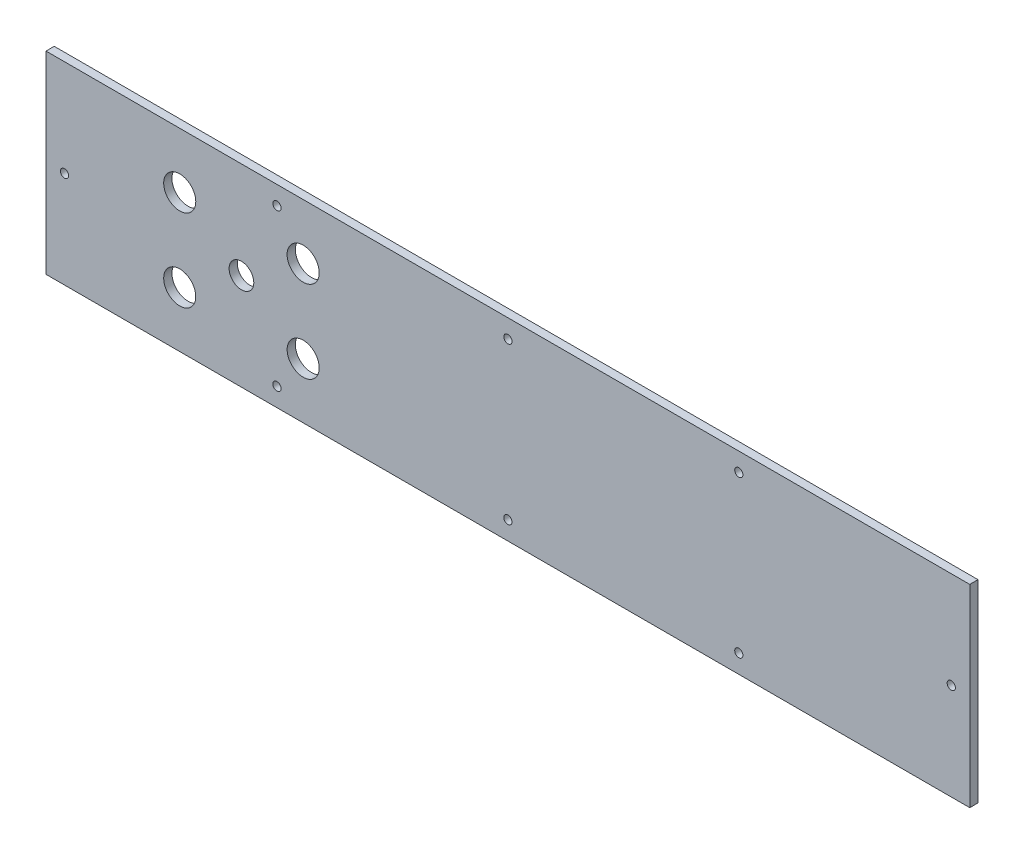
ISO-10303-21;
HEADER;
FILE_DESCRIPTION(('STEP AP214'),'2;1');
FILE_NAME('part.step','',(''),(''),'','','');
FILE_SCHEMA(('AUTOMOTIVE_DESIGN { 1 0 10303 214 1 1 1 1 }'));
ENDSEC;
DATA;
#1=APPLICATION_CONTEXT('core data for automotive mechanical design processes');
#2=APPLICATION_PROTOCOL_DEFINITION('international standard','automotive_design',2000,#1);
#3=PRODUCT_CONTEXT('',#1,'mechanical');
#4=PRODUCT('Part','Part','',(#3));
#5=PRODUCT_RELATED_PRODUCT_CATEGORY('part','',(#4));
#6=PRODUCT_DEFINITION_FORMATION('','',#4);
#7=PRODUCT_DEFINITION_CONTEXT('part definition',#1,'design');
#8=PRODUCT_DEFINITION('design','',#6,#7);
#9=PRODUCT_DEFINITION_SHAPE('','',#8);
#10=(LENGTH_UNIT() NAMED_UNIT(*) SI_UNIT(.MILLI.,.METRE.));
#11=(NAMED_UNIT(*) PLANE_ANGLE_UNIT() SI_UNIT($,.RADIAN.));
#12=(NAMED_UNIT(*) SI_UNIT($,.STERADIAN.) SOLID_ANGLE_UNIT());
#13=UNCERTAINTY_MEASURE_WITH_UNIT(LENGTH_MEASURE(1.E-05),#10,'distance_accuracy_value','');
#14=(GEOMETRIC_REPRESENTATION_CONTEXT(3) GLOBAL_UNCERTAINTY_ASSIGNED_CONTEXT((#13)) GLOBAL_UNIT_ASSIGNED_CONTEXT((#10,
#11,#12)) REPRESENTATION_CONTEXT('',''));
#15=CARTESIAN_POINT('',(0.,0.,0.));
#16=DIRECTION('',(0.,0.,1.));
#17=DIRECTION('',(1.,0.,0.));
#18=AXIS2_PLACEMENT_3D('',#15,#16,#17);
#19=CARTESIAN_POINT('',(0.,0.,4.));
#20=DIRECTION('',(0.,0.,1.));
#21=DIRECTION('',(1.,0.,0.));
#22=AXIS2_PLACEMENT_3D('',#19,#20,#21);
#23=PLANE('',#22);
#24=CARTESIAN_POINT('',(-112.25,85.0000000000041,4.));
#25=DIRECTION('',(0.,0.,1.));
#26=DIRECTION('',(-1.,0.,0.));
#27=AXIS2_PLACEMENT_3D('',#24,#25,#26);
#28=CIRCLE('',#27,2.);
#29=CARTESIAN_POINT('',(-114.25,85.0000000000041,4.));
#30=VERTEX_POINT('',#29);
#31=EDGE_CURVE('E177',#30,#30,#28,.T.);
#32=ORIENTED_EDGE('',*,*,#31,.F.);
#33=EDGE_LOOP('',(#32));
#34=FACE_BOUND('',#33,.T.);
#35=CARTESIAN_POINT('',(-336.75,8.99999999999596,4.));
#36=DIRECTION('',(0.,0.,1.));
#37=DIRECTION('',(-1.,0.,0.));
#38=AXIS2_PLACEMENT_3D('',#35,#36,#37);
#39=CIRCLE('',#38,2.);
#40=CARTESIAN_POINT('',(-338.75,8.99999999999596,4.));
#41=VERTEX_POINT('',#40);
#42=EDGE_CURVE('E165',#41,#41,#39,.T.);
#43=ORIENTED_EDGE('',*,*,#42,.F.);
#44=EDGE_LOOP('',(#43));
#45=FACE_BOUND('',#44,.T.);
#46=CARTESIAN_POINT('',(-324.,66.9999999999999,4.));
#47=DIRECTION('',(0.,0.,1.));
#48=DIRECTION('',(-1.,0.,0.));
#49=AXIS2_PLACEMENT_3D('',#46,#47,#48);
#50=CIRCLE('',#49,7.79999999999999);
#51=CARTESIAN_POINT('',(-331.8,66.9999999999999,4.));
#52=VERTEX_POINT('',#51);
#53=EDGE_CURVE('E153',#52,#52,#50,.T.);
#54=ORIENTED_EDGE('',*,*,#53,.F.);
#55=EDGE_LOOP('',(#54));
#56=FACE_BOUND('',#55,.T.);
#57=CARTESIAN_POINT('',(-324.,26.9999999999999,4.));
#58=DIRECTION('',(0.,0.,1.));
#59=DIRECTION('',(1.,0.,0.));
#60=AXIS2_PLACEMENT_3D('',#57,#58,#59);
#61=CIRCLE('',#60,7.79999999999999);
#62=CARTESIAN_POINT('',(-316.2,26.9999999999999,4.));
#63=VERTEX_POINT('',#62);
#64=EDGE_CURVE('E141',#63,#63,#61,.T.);
#65=ORIENTED_EDGE('',*,*,#64,.F.);
#66=EDGE_LOOP('',(#65));
#67=FACE_BOUND('',#66,.T.);
#68=CARTESIAN_POINT('',(-440.,46.9999999999999,4.));
#69=DIRECTION('',(0.,0.,1.));
#70=DIRECTION('',(-1.,0.,0.));
#71=AXIS2_PLACEMENT_3D('',#68,#69,#70);
#72=CIRCLE('',#71,2.);
#73=CARTESIAN_POINT('',(-442.,46.9999999999999,4.));
#74=VERTEX_POINT('',#73);
#75=EDGE_CURVE('E129',#74,#74,#72,.T.);
#76=ORIENTED_EDGE('',*,*,#75,.F.);
#77=EDGE_LOOP('',(#76));
#78=FACE_BOUND('',#77,.T.);
#79=CARTESIAN_POINT('',(-224.5,84.9999999999999,4.));
#80=DIRECTION('',(0.,0.,1.));
#81=DIRECTION('',(1.,0.,0.));
#82=AXIS2_PLACEMENT_3D('',#79,#80,#81);
#83=CIRCLE('',#82,2.);
#84=CARTESIAN_POINT('',(-222.5,84.9999999999999,4.));
#85=VERTEX_POINT('',#84);
#86=EDGE_CURVE('E117',#85,#85,#83,.T.);
#87=ORIENTED_EDGE('',*,*,#86,.F.);
#88=EDGE_LOOP('',(#87));
#89=FACE_BOUND('',#88,.T.);
#90=DIRECTION('',(0.,1.,0.));
#91=VECTOR('',#90,1.);
#92=CARTESIAN_POINT('',(0.,0.,4.));
#93=LINE('',#92,#91);
#94=CARTESIAN_POINT('',(0.,0.,4.));
#95=VERTEX_POINT('',#94);
#96=CARTESIAN_POINT('',(0.,93.9999999999999,4.));
#97=VERTEX_POINT('',#96);
#98=EDGE_CURVE('E87',#95,#97,#93,.T.);
#99=ORIENTED_EDGE('',*,*,#98,.T.);
#100=DIRECTION('',(-1.,0.,0.));
#101=VECTOR('',#100,1.);
#102=CARTESIAN_POINT('',(0.,93.9999999999999,4.));
#103=LINE('',#102,#101);
#104=CARTESIAN_POINT('',(-449.,93.9999999999999,4.));
#105=VERTEX_POINT('',#104);
#106=EDGE_CURVE('E82',#97,#105,#103,.T.);
#107=ORIENTED_EDGE('',*,*,#106,.T.);
#108=DIRECTION('',(0.,-1.,0.));
#109=VECTOR('',#108,1.);
#110=CARTESIAN_POINT('',(-449.,0.,4.));
#111=LINE('',#110,#109);
#112=CARTESIAN_POINT('',(-449.,0.,4.));
#113=VERTEX_POINT('',#112);
#114=EDGE_CURVE('E85',#105,#113,#111,.T.);
#115=ORIENTED_EDGE('',*,*,#114,.T.);
#116=DIRECTION('',(1.,0.,0.));
#117=VECTOR('',#116,1.);
#118=CARTESIAN_POINT('',(0.,0.,4.));
#119=LINE('',#118,#117);
#120=EDGE_CURVE('E52',#113,#95,#119,.T.);
#121=ORIENTED_EDGE('',*,*,#120,.T.);
#122=EDGE_LOOP('',(#99,#107,#115,#121));
#123=FACE_BOUND('',#122,.T.);
#124=CARTESIAN_POINT('',(-384.,26.9999999999999,4.));
#125=DIRECTION('',(0.,0.,1.));
#126=DIRECTION('',(-1.,0.,0.));
#127=AXIS2_PLACEMENT_3D('',#124,#125,#126);
#128=CIRCLE('',#127,7.79999999999999);
#129=CARTESIAN_POINT('',(-391.8,26.9999999999999,4.));
#130=VERTEX_POINT('',#129);
#131=EDGE_CURVE('E102',#130,#130,#128,.T.);
#132=ORIENTED_EDGE('',*,*,#131,.F.);
#133=EDGE_LOOP('',(#132));
#134=FACE_BOUND('',#133,.T.);
#135=CARTESIAN_POINT('',(-9.,46.9999999999999,4.));
#136=DIRECTION('',(0.,0.,1.));
#137=DIRECTION('',(1.,0.,0.));
#138=AXIS2_PLACEMENT_3D('',#135,#136,#137);
#139=CIRCLE('',#138,2.);
#140=CARTESIAN_POINT('',(-7.,46.9999999999999,4.));
#141=VERTEX_POINT('',#140);
#142=EDGE_CURVE('E123',#141,#141,#139,.T.);
#143=ORIENTED_EDGE('',*,*,#142,.F.);
#144=EDGE_LOOP('',(#143));
#145=FACE_BOUND('',#144,.T.);
#146=CARTESIAN_POINT('',(-224.5,8.99999999999998,4.));
#147=DIRECTION('',(0.,0.,1.));
#148=DIRECTION('',(-1.,0.,0.));
#149=AXIS2_PLACEMENT_3D('',#146,#147,#148);
#150=CIRCLE('',#149,2.);
#151=CARTESIAN_POINT('',(-226.5,8.99999999999998,4.));
#152=VERTEX_POINT('',#151);
#153=EDGE_CURVE('E135',#152,#152,#150,.T.);
#154=ORIENTED_EDGE('',*,*,#153,.F.);
#155=EDGE_LOOP('',(#154));
#156=FACE_BOUND('',#155,.T.);
#157=CARTESIAN_POINT('',(-384.,66.9999999999999,4.));
#158=DIRECTION('',(0.,0.,1.));
#159=DIRECTION('',(1.,0.,0.));
#160=AXIS2_PLACEMENT_3D('',#157,#158,#159);
#161=CIRCLE('',#160,7.79999999999999);
#162=CARTESIAN_POINT('',(-376.2,66.9999999999999,4.));
#163=VERTEX_POINT('',#162);
#164=EDGE_CURVE('E147',#163,#163,#161,.T.);
#165=ORIENTED_EDGE('',*,*,#164,.F.);
#166=EDGE_LOOP('',(#165));
#167=FACE_BOUND('',#166,.T.);
#168=CARTESIAN_POINT('',(-336.75,85.0000000000039,4.));
#169=DIRECTION('',(0.,0.,1.));
#170=DIRECTION('',(1.,0.,0.));
#171=AXIS2_PLACEMENT_3D('',#168,#169,#170);
#172=CIRCLE('',#171,2.);
#173=CARTESIAN_POINT('',(-334.75,85.0000000000039,4.));
#174=VERTEX_POINT('',#173);
#175=EDGE_CURVE('E159',#174,#174,#172,.T.);
#176=ORIENTED_EDGE('',*,*,#175,.F.);
#177=EDGE_LOOP('',(#176));
#178=FACE_BOUND('',#177,.T.);
#179=CARTESIAN_POINT('',(-112.25,8.99999999999618,4.));
#180=DIRECTION('',(0.,0.,1.));
#181=DIRECTION('',(1.,0.,0.));
#182=AXIS2_PLACEMENT_3D('',#179,#180,#181);
#183=CIRCLE('',#182,2.);
#184=CARTESIAN_POINT('',(-110.25,8.99999999999618,4.));
#185=VERTEX_POINT('',#184);
#186=EDGE_CURVE('E171',#185,#185,#183,.T.);
#187=ORIENTED_EDGE('',*,*,#186,.F.);
#188=EDGE_LOOP('',(#187));
#189=FACE_BOUND('',#188,.T.);
#190=CARTESIAN_POINT('',(-354.,46.9999999999999,4.));
#191=DIRECTION('',(0.,0.,1.));
#192=DIRECTION('',(1.,0.,0.));
#193=AXIS2_PLACEMENT_3D('',#190,#191,#192);
#194=CIRCLE('',#193,5.99999999999999);
#195=CARTESIAN_POINT('',(-348.,46.9999999999999,4.));
#196=VERTEX_POINT('',#195);
#197=EDGE_CURVE('E183',#196,#196,#194,.T.);
#198=ORIENTED_EDGE('',*,*,#197,.F.);
#199=EDGE_LOOP('',(#198));
#200=FACE_BOUND('',#199,.T.);
#201=ADVANCED_FACE('F35',(#34,#45,#56,#67,#78,#89,#123,#134,#145,#156,#167,#178,#189,#200),#23,.T.);
#202=CARTESIAN_POINT('',(0.,0.,0.));
#203=DIRECTION('',(0.,0.,1.));
#204=DIRECTION('',(1.,0.,0.));
#205=AXIS2_PLACEMENT_3D('',#202,#203,#204);
#206=PLANE('',#205);
#207=CARTESIAN_POINT('',(-112.25,85.0000000000041,0.));
#208=DIRECTION('',(0.,0.,1.));
#209=DIRECTION('',(-1.,0.,0.));
#210=AXIS2_PLACEMENT_3D('',#207,#208,#209);
#211=CIRCLE('',#210,2.);
#212=CARTESIAN_POINT('',(-114.25,85.0000000000041,0.));
#213=VERTEX_POINT('',#212);
#214=EDGE_CURVE('E180',#213,#213,#211,.T.);
#215=ORIENTED_EDGE('',*,*,#214,.T.);
#216=EDGE_LOOP('',(#215));
#217=FACE_BOUND('',#216,.T.);
#218=CARTESIAN_POINT('',(-336.75,8.99999999999596,0.));
#219=DIRECTION('',(0.,0.,1.));
#220=DIRECTION('',(-1.,0.,0.));
#221=AXIS2_PLACEMENT_3D('',#218,#219,#220);
#222=CIRCLE('',#221,2.);
#223=CARTESIAN_POINT('',(-338.75,8.99999999999596,0.));
#224=VERTEX_POINT('',#223);
#225=EDGE_CURVE('E168',#224,#224,#222,.T.);
#226=ORIENTED_EDGE('',*,*,#225,.T.);
#227=EDGE_LOOP('',(#226));
#228=FACE_BOUND('',#227,.T.);
#229=CARTESIAN_POINT('',(-324.,66.9999999999999,0.));
#230=DIRECTION('',(0.,0.,1.));
#231=DIRECTION('',(-1.,0.,0.));
#232=AXIS2_PLACEMENT_3D('',#229,#230,#231);
#233=CIRCLE('',#232,7.79999999999999);
#234=CARTESIAN_POINT('',(-331.8,66.9999999999999,0.));
#235=VERTEX_POINT('',#234);
#236=EDGE_CURVE('E156',#235,#235,#233,.T.);
#237=ORIENTED_EDGE('',*,*,#236,.T.);
#238=EDGE_LOOP('',(#237));
#239=FACE_BOUND('',#238,.T.);
#240=CARTESIAN_POINT('',(-324.,26.9999999999999,0.));
#241=DIRECTION('',(0.,0.,1.));
#242=DIRECTION('',(1.,0.,0.));
#243=AXIS2_PLACEMENT_3D('',#240,#241,#242);
#244=CIRCLE('',#243,7.79999999999999);
#245=CARTESIAN_POINT('',(-316.2,26.9999999999999,0.));
#246=VERTEX_POINT('',#245);
#247=EDGE_CURVE('E144',#246,#246,#244,.T.);
#248=ORIENTED_EDGE('',*,*,#247,.T.);
#249=EDGE_LOOP('',(#248));
#250=FACE_BOUND('',#249,.T.);
#251=CARTESIAN_POINT('',(-440.,46.9999999999999,0.));
#252=DIRECTION('',(0.,0.,1.));
#253=DIRECTION('',(-1.,0.,0.));
#254=AXIS2_PLACEMENT_3D('',#251,#252,#253);
#255=CIRCLE('',#254,2.);
#256=CARTESIAN_POINT('',(-442.,46.9999999999999,0.));
#257=VERTEX_POINT('',#256);
#258=EDGE_CURVE('E132',#257,#257,#255,.T.);
#259=ORIENTED_EDGE('',*,*,#258,.T.);
#260=EDGE_LOOP('',(#259));
#261=FACE_BOUND('',#260,.T.);
#262=CARTESIAN_POINT('',(-224.5,84.9999999999999,0.));
#263=DIRECTION('',(0.,0.,1.));
#264=DIRECTION('',(1.,0.,0.));
#265=AXIS2_PLACEMENT_3D('',#262,#263,#264);
#266=CIRCLE('',#265,2.);
#267=CARTESIAN_POINT('',(-222.5,84.9999999999999,0.));
#268=VERTEX_POINT('',#267);
#269=EDGE_CURVE('E120',#268,#268,#266,.T.);
#270=ORIENTED_EDGE('',*,*,#269,.T.);
#271=EDGE_LOOP('',(#270));
#272=FACE_BOUND('',#271,.T.);
#273=DIRECTION('',(0.,1.,0.));
#274=VECTOR('',#273,1.);
#275=CARTESIAN_POINT('',(0.,0.,0.));
#276=LINE('',#275,#274);
#277=CARTESIAN_POINT('',(0.,0.,0.));
#278=VERTEX_POINT('',#277);
#279=CARTESIAN_POINT('',(0.,93.9999999999999,0.));
#280=VERTEX_POINT('',#279);
#281=EDGE_CURVE('E99',#278,#280,#276,.T.);
#282=ORIENTED_EDGE('',*,*,#281,.F.);
#283=DIRECTION('',(1.,0.,0.));
#284=VECTOR('',#283,1.);
#285=CARTESIAN_POINT('',(0.,0.,0.));
#286=LINE('',#285,#284);
#287=CARTESIAN_POINT('',(-449.,0.,0.));
#288=VERTEX_POINT('',#287);
#289=EDGE_CURVE('E75',#288,#278,#286,.T.);
#290=ORIENTED_EDGE('',*,*,#289,.F.);
#291=DIRECTION('',(0.,-1.,0.));
#292=VECTOR('',#291,1.);
#293=CARTESIAN_POINT('',(-449.,0.,0.));
#294=LINE('',#293,#292);
#295=CARTESIAN_POINT('',(-449.,93.9999999999999,0.));
#296=VERTEX_POINT('',#295);
#297=EDGE_CURVE('E69',#296,#288,#294,.T.);
#298=ORIENTED_EDGE('',*,*,#297,.F.);
#299=DIRECTION('',(-1.,0.,0.));
#300=VECTOR('',#299,1.);
#301=CARTESIAN_POINT('',(0.,93.9999999999999,0.));
#302=LINE('',#301,#300);
#303=EDGE_CURVE('E91',#280,#296,#302,.T.);
#304=ORIENTED_EDGE('',*,*,#303,.F.);
#305=EDGE_LOOP('',(#282,#290,#298,#304));
#306=FACE_BOUND('',#305,.T.);
#307=CARTESIAN_POINT('',(-384.,26.9999999999999,0.));
#308=DIRECTION('',(0.,0.,1.));
#309=DIRECTION('',(-1.,0.,0.));
#310=AXIS2_PLACEMENT_3D('',#307,#308,#309);
#311=CIRCLE('',#310,7.79999999999999);
#312=CARTESIAN_POINT('',(-391.8,26.9999999999999,0.));
#313=VERTEX_POINT('',#312);
#314=EDGE_CURVE('E114',#313,#313,#311,.T.);
#315=ORIENTED_EDGE('',*,*,#314,.T.);
#316=EDGE_LOOP('',(#315));
#317=FACE_BOUND('',#316,.T.);
#318=CARTESIAN_POINT('',(-9.,46.9999999999999,0.));
#319=DIRECTION('',(0.,0.,1.));
#320=DIRECTION('',(1.,0.,0.));
#321=AXIS2_PLACEMENT_3D('',#318,#319,#320);
#322=CIRCLE('',#321,2.);
#323=CARTESIAN_POINT('',(-7.,46.9999999999999,0.));
#324=VERTEX_POINT('',#323);
#325=EDGE_CURVE('E126',#324,#324,#322,.T.);
#326=ORIENTED_EDGE('',*,*,#325,.T.);
#327=EDGE_LOOP('',(#326));
#328=FACE_BOUND('',#327,.T.);
#329=CARTESIAN_POINT('',(-224.5,8.99999999999998,0.));
#330=DIRECTION('',(0.,0.,1.));
#331=DIRECTION('',(-1.,0.,0.));
#332=AXIS2_PLACEMENT_3D('',#329,#330,#331);
#333=CIRCLE('',#332,2.);
#334=CARTESIAN_POINT('',(-226.5,8.99999999999998,0.));
#335=VERTEX_POINT('',#334);
#336=EDGE_CURVE('E138',#335,#335,#333,.T.);
#337=ORIENTED_EDGE('',*,*,#336,.T.);
#338=EDGE_LOOP('',(#337));
#339=FACE_BOUND('',#338,.T.);
#340=CARTESIAN_POINT('',(-384.,66.9999999999999,0.));
#341=DIRECTION('',(0.,0.,1.));
#342=DIRECTION('',(1.,0.,0.));
#343=AXIS2_PLACEMENT_3D('',#340,#341,#342);
#344=CIRCLE('',#343,7.79999999999999);
#345=CARTESIAN_POINT('',(-376.2,66.9999999999999,0.));
#346=VERTEX_POINT('',#345);
#347=EDGE_CURVE('E150',#346,#346,#344,.T.);
#348=ORIENTED_EDGE('',*,*,#347,.T.);
#349=EDGE_LOOP('',(#348));
#350=FACE_BOUND('',#349,.T.);
#351=CARTESIAN_POINT('',(-336.75,85.0000000000039,0.));
#352=DIRECTION('',(0.,0.,1.));
#353=DIRECTION('',(1.,0.,0.));
#354=AXIS2_PLACEMENT_3D('',#351,#352,#353);
#355=CIRCLE('',#354,2.);
#356=CARTESIAN_POINT('',(-334.75,85.0000000000039,0.));
#357=VERTEX_POINT('',#356);
#358=EDGE_CURVE('E162',#357,#357,#355,.T.);
#359=ORIENTED_EDGE('',*,*,#358,.T.);
#360=EDGE_LOOP('',(#359));
#361=FACE_BOUND('',#360,.T.);
#362=CARTESIAN_POINT('',(-112.25,8.99999999999618,0.));
#363=DIRECTION('',(0.,0.,1.));
#364=DIRECTION('',(1.,0.,0.));
#365=AXIS2_PLACEMENT_3D('',#362,#363,#364);
#366=CIRCLE('',#365,2.);
#367=CARTESIAN_POINT('',(-110.25,8.99999999999618,0.));
#368=VERTEX_POINT('',#367);
#369=EDGE_CURVE('E174',#368,#368,#366,.T.);
#370=ORIENTED_EDGE('',*,*,#369,.T.);
#371=EDGE_LOOP('',(#370));
#372=FACE_BOUND('',#371,.T.);
#373=CARTESIAN_POINT('',(-354.,46.9999999999999,0.));
#374=DIRECTION('',(0.,0.,1.));
#375=DIRECTION('',(1.,0.,0.));
#376=AXIS2_PLACEMENT_3D('',#373,#374,#375);
#377=CIRCLE('',#376,5.99999999999999);
#378=CARTESIAN_POINT('',(-348.,46.9999999999999,0.));
#379=VERTEX_POINT('',#378);
#380=EDGE_CURVE('E186',#379,#379,#377,.T.);
#381=ORIENTED_EDGE('',*,*,#380,.T.);
#382=EDGE_LOOP('',(#381));
#383=FACE_BOUND('',#382,.T.);
#384=ADVANCED_FACE('F110',(#217,#228,#239,#250,#261,#272,#306,#317,#328,#339,#350,#361,#372,
#383),#206,.F.);
#385=CARTESIAN_POINT('',(0.,0.,4.));
#386=DIRECTION('',(-1.,0.,0.));
#387=DIRECTION('',(0.,0.,1.));
#388=AXIS2_PLACEMENT_3D('',#385,#386,#387);
#389=PLANE('',#388);
#390=ORIENTED_EDGE('',*,*,#281,.T.);
#391=DIRECTION('',(0.,0.,-1.));
#392=VECTOR('',#391,1.);
#393=CARTESIAN_POINT('',(0.,93.9999999999999,4.));
#394=LINE('',#393,#392);
#395=EDGE_CURVE('E11',#97,#280,#394,.T.);
#396=ORIENTED_EDGE('',*,*,#395,.F.);
#397=ORIENTED_EDGE('',*,*,#98,.F.);
#398=DIRECTION('',(0.,0.,-1.));
#399=VECTOR('',#398,1.);
#400=CARTESIAN_POINT('',(0.,0.,4.));
#401=LINE('',#400,#399);
#402=EDGE_CURVE('E95',#95,#278,#401,.T.);
#403=ORIENTED_EDGE('',*,*,#402,.T.);
#404=EDGE_LOOP('',(#390,#396,#397,#403));
#405=FACE_BOUND('',#404,.T.);
#406=ADVANCED_FACE('F37',(#405),#389,.F.);
#407=CARTESIAN_POINT('',(0.,93.9999999999999,4.));
#408=DIRECTION('',(0.,-1.,0.));
#409=DIRECTION('',(1.,0.,0.));
#410=AXIS2_PLACEMENT_3D('',#407,#408,#409);
#411=PLANE('',#410);
#412=ORIENTED_EDGE('',*,*,#303,.T.);
#413=DIRECTION('',(0.,0.,-1.));
#414=VECTOR('',#413,1.);
#415=CARTESIAN_POINT('',(-449.,93.9999999999999,4.));
#416=LINE('',#415,#414);
#417=EDGE_CURVE('E44',#105,#296,#416,.T.);
#418=ORIENTED_EDGE('',*,*,#417,.F.);
#419=ORIENTED_EDGE('',*,*,#106,.F.);
#420=ORIENTED_EDGE('',*,*,#395,.T.);
#421=EDGE_LOOP('',(#412,#418,#419,#420));
#422=FACE_BOUND('',#421,.T.);
#423=ADVANCED_FACE('F90',(#422),#411,.F.);
#424=CARTESIAN_POINT('',(-449.,0.,4.));
#425=DIRECTION('',(1.,0.,0.));
#426=DIRECTION('',(0.,1.,0.));
#427=AXIS2_PLACEMENT_3D('',#424,#425,#426);
#428=PLANE('',#427);
#429=ORIENTED_EDGE('',*,*,#297,.T.);
#430=DIRECTION('',(0.,0.,-1.));
#431=VECTOR('',#430,1.);
#432=CARTESIAN_POINT('',(-449.,0.,4.));
#433=LINE('',#432,#431);
#434=EDGE_CURVE('E92',#113,#288,#433,.T.);
#435=ORIENTED_EDGE('',*,*,#434,.F.);
#436=ORIENTED_EDGE('',*,*,#114,.F.);
#437=ORIENTED_EDGE('',*,*,#417,.T.);
#438=EDGE_LOOP('',(#429,#435,#436,#437));
#439=FACE_BOUND('',#438,.T.);
#440=ADVANCED_FACE('F93',(#439),#428,.F.);
#441=CARTESIAN_POINT('',(0.,0.,4.));
#442=DIRECTION('',(0.,1.,0.));
#443=DIRECTION('',(-1.,0.,0.));
#444=AXIS2_PLACEMENT_3D('',#441,#442,#443);
#445=PLANE('',#444);
#446=ORIENTED_EDGE('',*,*,#289,.T.);
#447=ORIENTED_EDGE('',*,*,#402,.F.);
#448=ORIENTED_EDGE('',*,*,#120,.F.);
#449=ORIENTED_EDGE('',*,*,#434,.T.);
#450=EDGE_LOOP('',(#446,#447,#448,#449));
#451=FACE_BOUND('',#450,.T.);
#452=ADVANCED_FACE('F107',(#451),#445,.F.);
#453=CARTESIAN_POINT('',(-384.,26.9999999999999,4.));
#454=DIRECTION('',(0.,0.,-1.));
#455=DIRECTION('',(-1.,0.,0.));
#456=AXIS2_PLACEMENT_3D('',#453,#454,#455);
#457=CYLINDRICAL_SURFACE('',#456,7.79999999999999);
#458=ORIENTED_EDGE('',*,*,#131,.T.);
#459=EDGE_LOOP('',(#458));
#460=FACE_BOUND('',#459,.T.);
#461=ORIENTED_EDGE('',*,*,#314,.F.);
#462=EDGE_LOOP('',(#461));
#463=FACE_BOUND('',#462,.T.);
#464=ADVANCED_FACE('F206',(#460,#463),#457,.F.);
#465=CARTESIAN_POINT('',(-224.5,84.9999999999999,4.));
#466=DIRECTION('',(0.,0.,-1.));
#467=DIRECTION('',(-1.,0.,0.));
#468=AXIS2_PLACEMENT_3D('',#465,#466,#467);
#469=CYLINDRICAL_SURFACE('',#468,2.);
#470=ORIENTED_EDGE('',*,*,#86,.T.);
#471=EDGE_LOOP('',(#470));
#472=FACE_BOUND('',#471,.T.);
#473=ORIENTED_EDGE('',*,*,#269,.F.);
#474=EDGE_LOOP('',(#473));
#475=FACE_BOUND('',#474,.T.);
#476=ADVANCED_FACE('F254',(#472,#475),#469,.F.);
#477=CARTESIAN_POINT('',(-9.,46.9999999999999,4.));
#478=DIRECTION('',(0.,0.,-1.));
#479=DIRECTION('',(-1.,0.,0.));
#480=AXIS2_PLACEMENT_3D('',#477,#478,#479);
#481=CYLINDRICAL_SURFACE('',#480,2.);
#482=ORIENTED_EDGE('',*,*,#142,.T.);
#483=EDGE_LOOP('',(#482));
#484=FACE_BOUND('',#483,.T.);
#485=ORIENTED_EDGE('',*,*,#325,.F.);
#486=EDGE_LOOP('',(#485));
#487=FACE_BOUND('',#486,.T.);
#488=ADVANCED_FACE('F262',(#484,#487),#481,.F.);
#489=CARTESIAN_POINT('',(-440.,46.9999999999999,4.));
#490=DIRECTION('',(0.,0.,-1.));
#491=DIRECTION('',(-1.,0.,0.));
#492=AXIS2_PLACEMENT_3D('',#489,#490,#491);
#493=CYLINDRICAL_SURFACE('',#492,2.);
#494=ORIENTED_EDGE('',*,*,#75,.T.);
#495=EDGE_LOOP('',(#494));
#496=FACE_BOUND('',#495,.T.);
#497=ORIENTED_EDGE('',*,*,#258,.F.);
#498=EDGE_LOOP('',(#497));
#499=FACE_BOUND('',#498,.T.);
#500=ADVANCED_FACE('F270',(#496,#499),#493,.F.);
#501=CARTESIAN_POINT('',(-224.5,8.99999999999998,4.));
#502=DIRECTION('',(0.,0.,-1.));
#503=DIRECTION('',(-1.,0.,0.));
#504=AXIS2_PLACEMENT_3D('',#501,#502,#503);
#505=CYLINDRICAL_SURFACE('',#504,2.);
#506=ORIENTED_EDGE('',*,*,#153,.T.);
#507=EDGE_LOOP('',(#506));
#508=FACE_BOUND('',#507,.T.);
#509=ORIENTED_EDGE('',*,*,#336,.F.);
#510=EDGE_LOOP('',(#509));
#511=FACE_BOUND('',#510,.T.);
#512=ADVANCED_FACE('F279',(#508,#511),#505,.F.);
#513=CARTESIAN_POINT('',(-324.,26.9999999999999,4.));
#514=DIRECTION('',(0.,0.,-1.));
#515=DIRECTION('',(-1.,0.,0.));
#516=AXIS2_PLACEMENT_3D('',#513,#514,#515);
#517=CYLINDRICAL_SURFACE('',#516,7.79999999999999);
#518=ORIENTED_EDGE('',*,*,#64,.T.);
#519=EDGE_LOOP('',(#518));
#520=FACE_BOUND('',#519,.T.);
#521=ORIENTED_EDGE('',*,*,#247,.F.);
#522=EDGE_LOOP('',(#521));
#523=FACE_BOUND('',#522,.T.);
#524=ADVANCED_FACE('F288',(#520,#523),#517,.F.);
#525=CARTESIAN_POINT('',(-384.,66.9999999999999,4.));
#526=DIRECTION('',(0.,0.,-1.));
#527=DIRECTION('',(-1.,0.,0.));
#528=AXIS2_PLACEMENT_3D('',#525,#526,#527);
#529=CYLINDRICAL_SURFACE('',#528,7.79999999999999);
#530=ORIENTED_EDGE('',*,*,#164,.T.);
#531=EDGE_LOOP('',(#530));
#532=FACE_BOUND('',#531,.T.);
#533=ORIENTED_EDGE('',*,*,#347,.F.);
#534=EDGE_LOOP('',(#533));
#535=FACE_BOUND('',#534,.T.);
#536=ADVANCED_FACE('F297',(#532,#535),#529,.F.);
#537=CARTESIAN_POINT('',(-324.,66.9999999999999,4.));
#538=DIRECTION('',(0.,0.,-1.));
#539=DIRECTION('',(-1.,0.,0.));
#540=AXIS2_PLACEMENT_3D('',#537,#538,#539);
#541=CYLINDRICAL_SURFACE('',#540,7.79999999999999);
#542=ORIENTED_EDGE('',*,*,#53,.T.);
#543=EDGE_LOOP('',(#542));
#544=FACE_BOUND('',#543,.T.);
#545=ORIENTED_EDGE('',*,*,#236,.F.);
#546=EDGE_LOOP('',(#545));
#547=FACE_BOUND('',#546,.T.);
#548=ADVANCED_FACE('F306',(#544,#547),#541,.F.);
#549=CARTESIAN_POINT('',(-336.75,85.0000000000039,4.));
#550=DIRECTION('',(0.,0.,-1.));
#551=DIRECTION('',(-1.,0.,0.));
#552=AXIS2_PLACEMENT_3D('',#549,#550,#551);
#553=CYLINDRICAL_SURFACE('',#552,2.);
#554=ORIENTED_EDGE('',*,*,#175,.T.);
#555=EDGE_LOOP('',(#554));
#556=FACE_BOUND('',#555,.T.);
#557=ORIENTED_EDGE('',*,*,#358,.F.);
#558=EDGE_LOOP('',(#557));
#559=FACE_BOUND('',#558,.T.);
#560=ADVANCED_FACE('F315',(#556,#559),#553,.F.);
#561=CARTESIAN_POINT('',(-336.75,8.99999999999596,4.));
#562=DIRECTION('',(0.,0.,-1.));
#563=DIRECTION('',(-1.,0.,0.));
#564=AXIS2_PLACEMENT_3D('',#561,#562,#563);
#565=CYLINDRICAL_SURFACE('',#564,2.);
#566=ORIENTED_EDGE('',*,*,#42,.T.);
#567=EDGE_LOOP('',(#566));
#568=FACE_BOUND('',#567,.T.);
#569=ORIENTED_EDGE('',*,*,#225,.F.);
#570=EDGE_LOOP('',(#569));
#571=FACE_BOUND('',#570,.T.);
#572=ADVANCED_FACE('F324',(#568,#571),#565,.F.);
#573=CARTESIAN_POINT('',(-112.25,8.99999999999618,4.));
#574=DIRECTION('',(0.,0.,-1.));
#575=DIRECTION('',(-1.,0.,0.));
#576=AXIS2_PLACEMENT_3D('',#573,#574,#575);
#577=CYLINDRICAL_SURFACE('',#576,2.);
#578=ORIENTED_EDGE('',*,*,#186,.T.);
#579=EDGE_LOOP('',(#578));
#580=FACE_BOUND('',#579,.T.);
#581=ORIENTED_EDGE('',*,*,#369,.F.);
#582=EDGE_LOOP('',(#581));
#583=FACE_BOUND('',#582,.T.);
#584=ADVANCED_FACE('F333',(#580,#583),#577,.F.);
#585=CARTESIAN_POINT('',(-112.25,85.0000000000041,4.));
#586=DIRECTION('',(0.,0.,-1.));
#587=DIRECTION('',(-1.,0.,0.));
#588=AXIS2_PLACEMENT_3D('',#585,#586,#587);
#589=CYLINDRICAL_SURFACE('',#588,2.);
#590=ORIENTED_EDGE('',*,*,#31,.T.);
#591=EDGE_LOOP('',(#590));
#592=FACE_BOUND('',#591,.T.);
#593=ORIENTED_EDGE('',*,*,#214,.F.);
#594=EDGE_LOOP('',(#593));
#595=FACE_BOUND('',#594,.T.);
#596=ADVANCED_FACE('F342',(#592,#595),#589,.F.);
#597=CARTESIAN_POINT('',(-354.,46.9999999999999,4.));
#598=DIRECTION('',(0.,0.,-1.));
#599=DIRECTION('',(-1.,0.,0.));
#600=AXIS2_PLACEMENT_3D('',#597,#598,#599);
#601=CYLINDRICAL_SURFACE('',#600,5.99999999999999);
#602=ORIENTED_EDGE('',*,*,#197,.T.);
#603=EDGE_LOOP('',(#602));
#604=FACE_BOUND('',#603,.T.);
#605=ORIENTED_EDGE('',*,*,#380,.F.);
#606=EDGE_LOOP('',(#605));
#607=FACE_BOUND('',#606,.T.);
#608=ADVANCED_FACE('F192',(#604,#607),#601,.F.);
#609=CLOSED_SHELL('',(#201,#384,#406,#423,#440,#452,#464,#476,#488,#500,#512,#524,#536,#548,
#560,#572,#584,#596,#608));
#610=MANIFOLD_SOLID_BREP('B2',#609);
#611=ADVANCED_BREP_SHAPE_REPRESENTATION('',(#18,#610),#14);
#612=SHAPE_DEFINITION_REPRESENTATION(#9,#611);
ENDSEC;
END-ISO-10303-21;
